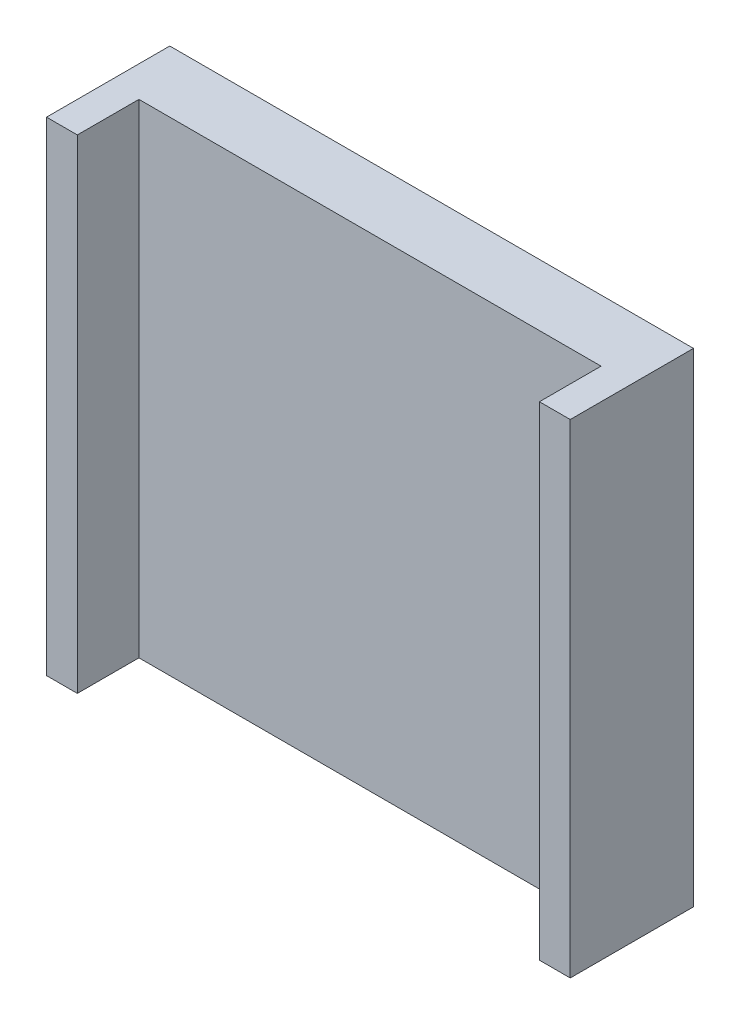
ISO-10303-21;
HEADER;
FILE_DESCRIPTION(('STEP AP214'),'2;1');
FILE_NAME('part.step','',(''),(''),'','','');
FILE_SCHEMA(('AUTOMOTIVE_DESIGN { 1 0 10303 214 1 1 1 1 }'));
ENDSEC;
DATA;
#1=APPLICATION_CONTEXT('core data for automotive mechanical design processes');
#2=APPLICATION_PROTOCOL_DEFINITION('international standard','automotive_design',2000,#1);
#3=PRODUCT_CONTEXT('',#1,'mechanical');
#4=PRODUCT('Part','Part','',(#3));
#5=PRODUCT_RELATED_PRODUCT_CATEGORY('part','',(#4));
#6=PRODUCT_DEFINITION_FORMATION('','',#4);
#7=PRODUCT_DEFINITION_CONTEXT('part definition',#1,'design');
#8=PRODUCT_DEFINITION('design','',#6,#7);
#9=PRODUCT_DEFINITION_SHAPE('','',#8);
#10=(LENGTH_UNIT() NAMED_UNIT(*) SI_UNIT(.MILLI.,.METRE.));
#11=(NAMED_UNIT(*) PLANE_ANGLE_UNIT() SI_UNIT($,.RADIAN.));
#12=(NAMED_UNIT(*) SI_UNIT($,.STERADIAN.) SOLID_ANGLE_UNIT());
#13=UNCERTAINTY_MEASURE_WITH_UNIT(LENGTH_MEASURE(1.E-05),#10,'distance_accuracy_value','');
#14=(GEOMETRIC_REPRESENTATION_CONTEXT(3) GLOBAL_UNCERTAINTY_ASSIGNED_CONTEXT((#13)) GLOBAL_UNIT_ASSIGNED_CONTEXT((#10,
#11,#12)) REPRESENTATION_CONTEXT('',''));
#15=CARTESIAN_POINT('',(0.,0.,0.));
#16=DIRECTION('',(0.,0.,1.));
#17=DIRECTION('',(1.,0.,0.));
#18=AXIS2_PLACEMENT_3D('',#15,#16,#17);
#19=CARTESIAN_POINT('',(-30.2801558192198,78.5,-2.27592265653072));
#20=DIRECTION('',(0.,0.,-1.));
#21=DIRECTION('',(-1.,0.,0.));
#22=AXIS2_PLACEMENT_3D('',#19,#20,#21);
#23=PLANE('',#22);
#24=DIRECTION('',(1.,0.,0.));
#25=VECTOR('',#24,1.);
#26=CARTESIAN_POINT('',(-30.2801558192198,0.,-2.27592265653072));
#27=LINE('',#26,#25);
#28=CARTESIAN_POINT('',(-30.2801558192198,0.,-2.27592265653072));
#29=VERTEX_POINT('',#28);
#30=CARTESIAN_POINT('',(-25.2801558192198,0.,-2.27592265653072));
#31=VERTEX_POINT('',#30);
#32=EDGE_CURVE('E118',#29,#31,#27,.T.);
#33=ORIENTED_EDGE('',*,*,#32,.T.);
#34=DIRECTION('',(0.,1.,0.));
#35=VECTOR('',#34,1.);
#36=CARTESIAN_POINT('',(-25.2801558192198,-9.99999999999999,-2.27592265653072));
#37=LINE('',#36,#35);
#38=CARTESIAN_POINT('',(-25.2801558192198,78.5,-2.27592265653072));
#39=VERTEX_POINT('',#38);
#40=EDGE_CURVE('E110',#31,#39,#37,.T.);
#41=ORIENTED_EDGE('',*,*,#40,.T.);
#42=DIRECTION('',(1.,0.,0.));
#43=VECTOR('',#42,1.);
#44=CARTESIAN_POINT('',(-30.2801558192198,78.5,-2.27592265653072));
#45=LINE('',#44,#43);
#46=CARTESIAN_POINT('',(-30.2801558192198,78.5,-2.27592265653072));
#47=VERTEX_POINT('',#46);
#48=EDGE_CURVE('E86',#47,#39,#45,.T.);
#49=ORIENTED_EDGE('',*,*,#48,.F.);
#50=DIRECTION('',(0.,-1.,0.));
#51=VECTOR('',#50,1.);
#52=CARTESIAN_POINT('',(-30.2801558192198,78.5,-2.27592265653072));
#53=LINE('',#52,#51);
#54=EDGE_CURVE('E148',#47,#29,#53,.T.);
#55=ORIENTED_EDGE('',*,*,#54,.T.);
#56=EDGE_LOOP('',(#33,#41,#49,#55));
#57=FACE_BOUND('',#56,.T.);
#58=ADVANCED_FACE('F33',(#57),#23,.F.);
#59=CARTESIAN_POINT('',(-30.2801558192198,78.5,-22.2759226565307));
#60=DIRECTION('',(1.,0.,0.));
#61=DIRECTION('',(0.,0.,-1.));
#62=AXIS2_PLACEMENT_3D('',#59,#60,#61);
#63=PLANE('',#62);
#64=DIRECTION('',(0.,0.,1.));
#65=VECTOR('',#64,1.);
#66=CARTESIAN_POINT('',(-30.2801558192198,0.,-22.2759226565307));
#67=LINE('',#66,#65);
#68=CARTESIAN_POINT('',(-30.2801558192198,0.,-22.2759226565307));
#69=VERTEX_POINT('',#68);
#70=EDGE_CURVE('E134',#69,#29,#67,.T.);
#71=ORIENTED_EDGE('',*,*,#70,.T.);
#72=ORIENTED_EDGE('',*,*,#54,.F.);
#73=DIRECTION('',(0.,0.,1.));
#74=VECTOR('',#73,1.);
#75=CARTESIAN_POINT('',(-30.2801558192198,78.5,-22.2759226565307));
#76=LINE('',#75,#74);
#77=CARTESIAN_POINT('',(-30.2801558192198,78.5,-22.2759226565307));
#78=VERTEX_POINT('',#77);
#79=EDGE_CURVE('E124',#78,#47,#76,.T.);
#80=ORIENTED_EDGE('',*,*,#79,.F.);
#81=DIRECTION('',(0.,-1.,0.));
#82=VECTOR('',#81,1.);
#83=CARTESIAN_POINT('',(-30.2801558192198,78.5,-22.2759226565307));
#84=LINE('',#83,#82);
#85=EDGE_CURVE('E133',#78,#69,#84,.T.);
#86=ORIENTED_EDGE('',*,*,#85,.T.);
#87=EDGE_LOOP('',(#71,#72,#80,#86));
#88=FACE_BOUND('',#87,.T.);
#89=ADVANCED_FACE('F35',(#88),#63,.F.);
#90=CARTESIAN_POINT('',(49.7198441807802,78.5,-2.27592265653072));
#91=VERTEX_POINT('',#90);
#92=CARTESIAN_POINT('',(54.7198441807802,78.5,-2.27592265653072));
#93=VERTEX_POINT('',#92);
#94=EDGE_CURVE('E127',#91,#93,#45,.T.);
#95=ORIENTED_EDGE('',*,*,#94,.F.);
#96=DIRECTION('',(0.,1.,0.));
#97=VECTOR('',#96,1.);
#98=CARTESIAN_POINT('',(49.7198441807802,-9.99999999999999,-2.27592265653072));
#99=LINE('',#98,#97);
#100=CARTESIAN_POINT('',(49.7198441807802,0.,-2.27592265653072));
#101=VERTEX_POINT('',#100);
#102=EDGE_CURVE('E119',#101,#91,#99,.T.);
#103=ORIENTED_EDGE('',*,*,#102,.F.);
#104=CARTESIAN_POINT('',(54.7198441807802,0.,-2.27592265653072));
#105=VERTEX_POINT('',#104);
#106=EDGE_CURVE('E137',#101,#105,#27,.T.);
#107=ORIENTED_EDGE('',*,*,#106,.T.);
#108=DIRECTION('',(0.,-1.,0.));
#109=VECTOR('',#108,1.);
#110=CARTESIAN_POINT('',(54.7198441807802,78.5,-2.27592265653072));
#111=LINE('',#110,#109);
#112=EDGE_CURVE('E145',#93,#105,#111,.T.);
#113=ORIENTED_EDGE('',*,*,#112,.F.);
#114=EDGE_LOOP('',(#95,#103,#107,#113));
#115=FACE_BOUND('',#114,.T.);
#116=ADVANCED_FACE('F169',(#115),#23,.F.);
#117=CARTESIAN_POINT('',(54.7198441807802,78.5,-22.2759226565307));
#118=DIRECTION('',(-1.,0.,0.));
#119=DIRECTION('',(0.,0.,1.));
#120=AXIS2_PLACEMENT_3D('',#117,#118,#119);
#121=PLANE('',#120);
#122=DIRECTION('',(0.,0.,-1.));
#123=VECTOR('',#122,1.);
#124=CARTESIAN_POINT('',(54.7198441807802,0.,-22.2759226565307));
#125=LINE('',#124,#123);
#126=CARTESIAN_POINT('',(54.7198441807802,0.,-22.2759226565307));
#127=VERTEX_POINT('',#126);
#128=EDGE_CURVE('E139',#105,#127,#125,.T.);
#129=ORIENTED_EDGE('',*,*,#128,.T.);
#130=DIRECTION('',(0.,-1.,0.));
#131=VECTOR('',#130,1.);
#132=CARTESIAN_POINT('',(54.7198441807802,78.5,-22.2759226565307));
#133=LINE('',#132,#131);
#134=CARTESIAN_POINT('',(54.7198441807802,78.5,-22.2759226565307));
#135=VERTEX_POINT('',#134);
#136=EDGE_CURVE('E143',#135,#127,#133,.T.);
#137=ORIENTED_EDGE('',*,*,#136,.F.);
#138=DIRECTION('',(0.,0.,-1.));
#139=VECTOR('',#138,1.);
#140=CARTESIAN_POINT('',(54.7198441807802,78.5,-22.2759226565307));
#141=LINE('',#140,#139);
#142=EDGE_CURVE('E126',#93,#135,#141,.T.);
#143=ORIENTED_EDGE('',*,*,#142,.F.);
#144=ORIENTED_EDGE('',*,*,#112,.T.);
#145=EDGE_LOOP('',(#129,#137,#143,#144));
#146=FACE_BOUND('',#145,.T.);
#147=ADVANCED_FACE('F174',(#146),#121,.F.);
#148=CARTESIAN_POINT('',(-30.2801558192198,78.5,-22.2759226565307));
#149=DIRECTION('',(0.,0.,1.));
#150=DIRECTION('',(1.,0.,0.));
#151=AXIS2_PLACEMENT_3D('',#148,#149,#150);
#152=PLANE('',#151);
#153=DIRECTION('',(-1.,0.,0.));
#154=VECTOR('',#153,1.);
#155=CARTESIAN_POINT('',(-30.2801558192198,0.,-22.2759226565307));
#156=LINE('',#155,#154);
#157=EDGE_CURVE('E78',#127,#69,#156,.T.);
#158=ORIENTED_EDGE('',*,*,#157,.T.);
#159=ORIENTED_EDGE('',*,*,#85,.F.);
#160=DIRECTION('',(-1.,0.,0.));
#161=VECTOR('',#160,1.);
#162=CARTESIAN_POINT('',(-30.2801558192198,78.5,-22.2759226565307));
#163=LINE('',#162,#161);
#164=EDGE_CURVE('E57',#135,#78,#163,.T.);
#165=ORIENTED_EDGE('',*,*,#164,.F.);
#166=ORIENTED_EDGE('',*,*,#136,.T.);
#167=EDGE_LOOP('',(#158,#159,#165,#166));
#168=FACE_BOUND('',#167,.T.);
#169=ADVANCED_FACE('F175',(#168),#152,.F.);
#170=CARTESIAN_POINT('',(0.,78.5,0.));
#171=DIRECTION('',(0.,1.,0.));
#172=DIRECTION('',(0.,0.,1.));
#173=AXIS2_PLACEMENT_3D('',#170,#171,#172);
#174=PLANE('',#173);
#175=DIRECTION('',(0.,0.,1.));
#176=VECTOR('',#175,1.);
#177=CARTESIAN_POINT('',(-25.2801558192198,78.5,-2.27592265653072));
#178=LINE('',#177,#176);
#179=CARTESIAN_POINT('',(-25.2801558192198,78.5,-12.2759226565307));
#180=VERTEX_POINT('',#179);
#181=EDGE_CURVE('E108',#180,#39,#178,.T.);
#182=ORIENTED_EDGE('',*,*,#181,.F.);
#183=DIRECTION('',(-1.,0.,0.));
#184=VECTOR('',#183,1.);
#185=CARTESIAN_POINT('',(-25.2801558192198,78.5,-12.2759226565307));
#186=LINE('',#185,#184);
#187=CARTESIAN_POINT('',(49.7198441807802,78.5,-12.2759226565307));
#188=VERTEX_POINT('',#187);
#189=EDGE_CURVE('E120',#188,#180,#186,.T.);
#190=ORIENTED_EDGE('',*,*,#189,.F.);
#191=DIRECTION('',(0.,0.,-1.));
#192=VECTOR('',#191,1.);
#193=CARTESIAN_POINT('',(49.7198441807802,78.5,-2.27592265653072));
#194=LINE('',#193,#192);
#195=EDGE_CURVE('E115',#91,#188,#194,.T.);
#196=ORIENTED_EDGE('',*,*,#195,.F.);
#197=ORIENTED_EDGE('',*,*,#94,.T.);
#198=ORIENTED_EDGE('',*,*,#142,.T.);
#199=ORIENTED_EDGE('',*,*,#164,.T.);
#200=ORIENTED_EDGE('',*,*,#79,.T.);
#201=ORIENTED_EDGE('',*,*,#48,.T.);
#202=EDGE_LOOP('',(#182,#190,#196,#197,#198,#199,#200,#201));
#203=FACE_BOUND('',#202,.T.);
#204=ADVANCED_FACE('F122',(#203),#174,.T.);
#205=CARTESIAN_POINT('',(0.,0.,0.));
#206=DIRECTION('',(0.,1.,0.));
#207=DIRECTION('',(0.,0.,1.));
#208=AXIS2_PLACEMENT_3D('',#205,#206,#207);
#209=PLANE('',#208);
#210=DIRECTION('',(-1.,0.,0.));
#211=VECTOR('',#210,1.);
#212=CARTESIAN_POINT('',(0.,0.,-12.2759226565307));
#213=LINE('',#212,#211);
#214=CARTESIAN_POINT('',(49.7198441807802,0.,-12.2759226565307));
#215=VERTEX_POINT('',#214);
#216=CARTESIAN_POINT('',(-25.2801558192198,0.,-12.2759226565307));
#217=VERTEX_POINT('',#216);
#218=EDGE_CURVE('E41',#215,#217,#213,.T.);
#219=ORIENTED_EDGE('',*,*,#218,.T.);
#220=DIRECTION('',(0.,0.,1.));
#221=VECTOR('',#220,1.);
#222=CARTESIAN_POINT('',(-25.2801558192198,0.,0.));
#223=LINE('',#222,#221);
#224=EDGE_CURVE('E11',#217,#31,#223,.T.);
#225=ORIENTED_EDGE('',*,*,#224,.T.);
#226=ORIENTED_EDGE('',*,*,#32,.F.);
#227=ORIENTED_EDGE('',*,*,#70,.F.);
#228=ORIENTED_EDGE('',*,*,#157,.F.);
#229=ORIENTED_EDGE('',*,*,#128,.F.);
#230=ORIENTED_EDGE('',*,*,#106,.F.);
#231=DIRECTION('',(0.,0.,-1.));
#232=VECTOR('',#231,1.);
#233=CARTESIAN_POINT('',(49.7198441807802,0.,0.));
#234=LINE('',#233,#232);
#235=EDGE_CURVE('E150',#101,#215,#234,.T.);
#236=ORIENTED_EDGE('',*,*,#235,.T.);
#237=EDGE_LOOP('',(#219,#225,#226,#227,#228,#229,#230,#236));
#238=FACE_BOUND('',#237,.T.);
#239=ADVANCED_FACE('F154',(#238),#209,.F.);
#240=CARTESIAN_POINT('',(-25.2801558192198,-9.99999999999999,-2.27592265653072));
#241=DIRECTION('',(-1.,0.,0.));
#242=DIRECTION('',(0.,0.,1.));
#243=AXIS2_PLACEMENT_3D('',#240,#241,#242);
#244=PLANE('',#243);
#245=DIRECTION('',(0.,1.,0.));
#246=VECTOR('',#245,1.);
#247=CARTESIAN_POINT('',(-25.2801558192198,-9.99999999999999,-12.2759226565307));
#248=LINE('',#247,#246);
#249=EDGE_CURVE('E112',#217,#180,#248,.T.);
#250=ORIENTED_EDGE('',*,*,#249,.T.);
#251=ORIENTED_EDGE('',*,*,#181,.T.);
#252=ORIENTED_EDGE('',*,*,#40,.F.);
#253=ORIENTED_EDGE('',*,*,#224,.F.);
#254=EDGE_LOOP('',(#250,#251,#252,#253));
#255=FACE_BOUND('',#254,.T.);
#256=ADVANCED_FACE('F109',(#255),#244,.F.);
#257=CARTESIAN_POINT('',(-25.2801558192198,-9.99999999999999,-12.2759226565307));
#258=DIRECTION('',(0.,0.,-1.));
#259=DIRECTION('',(-1.,0.,0.));
#260=AXIS2_PLACEMENT_3D('',#257,#258,#259);
#261=PLANE('',#260);
#262=DIRECTION('',(0.,1.,0.));
#263=VECTOR('',#262,1.);
#264=CARTESIAN_POINT('',(49.7198441807802,-9.99999999999999,-12.2759226565307));
#265=LINE('',#264,#263);
#266=EDGE_CURVE('E48',#215,#188,#265,.T.);
#267=ORIENTED_EDGE('',*,*,#266,.T.);
#268=ORIENTED_EDGE('',*,*,#189,.T.);
#269=ORIENTED_EDGE('',*,*,#249,.F.);
#270=ORIENTED_EDGE('',*,*,#218,.F.);
#271=EDGE_LOOP('',(#267,#268,#269,#270));
#272=FACE_BOUND('',#271,.T.);
#273=ADVANCED_FACE('F157',(#272),#261,.F.);
#274=CARTESIAN_POINT('',(49.7198441807802,-9.99999999999999,-2.27592265653072));
#275=DIRECTION('',(1.,0.,0.));
#276=DIRECTION('',(0.,0.,-1.));
#277=AXIS2_PLACEMENT_3D('',#274,#275,#276);
#278=PLANE('',#277);
#279=ORIENTED_EDGE('',*,*,#102,.T.);
#280=ORIENTED_EDGE('',*,*,#195,.T.);
#281=ORIENTED_EDGE('',*,*,#266,.F.);
#282=ORIENTED_EDGE('',*,*,#235,.F.);
#283=EDGE_LOOP('',(#279,#280,#281,#282));
#284=FACE_BOUND('',#283,.T.);
#285=ADVANCED_FACE('F165',(#284),#278,.F.);
#286=CLOSED_SHELL('',(#58,#89,#116,#147,#169,#204,#239,#256,#273,#285));
#287=MANIFOLD_SOLID_BREP('B2',#286);
#288=ADVANCED_BREP_SHAPE_REPRESENTATION('',(#18,#287),#14);
#289=SHAPE_DEFINITION_REPRESENTATION(#9,#288);
ENDSEC;
END-ISO-10303-21;
